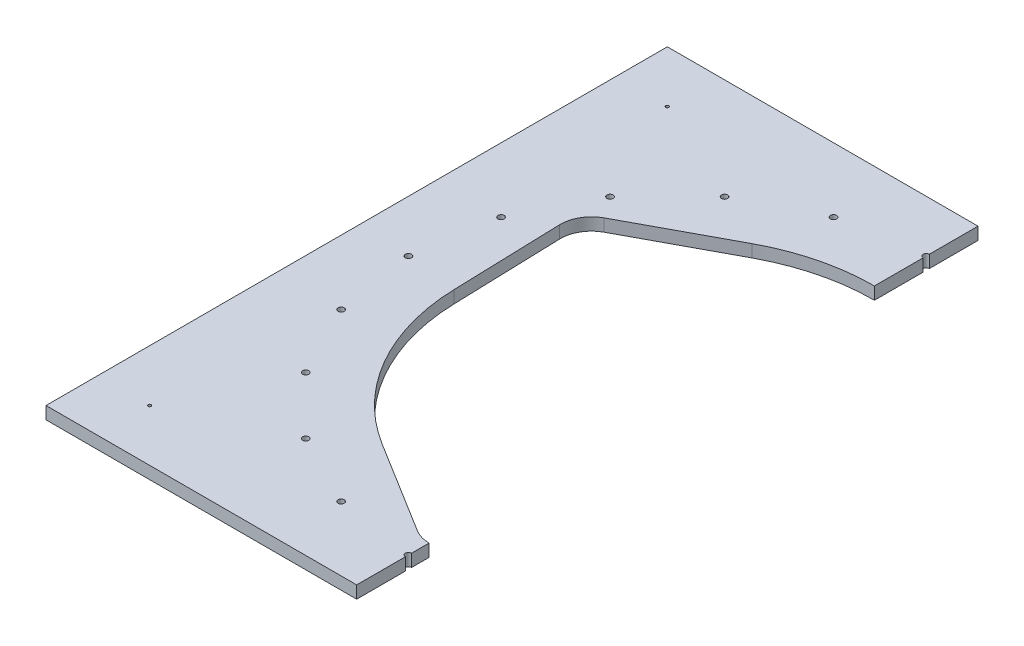
ISO-10303-21;
HEADER;
FILE_DESCRIPTION(('STEP AP214'),'2;1');
FILE_NAME('part.step','',(''),(''),'','','');
FILE_SCHEMA(('AUTOMOTIVE_DESIGN { 1 0 10303 214 1 1 1 1 }'));
ENDSEC;
DATA;
#1=APPLICATION_CONTEXT('core data for automotive mechanical design processes');
#2=APPLICATION_PROTOCOL_DEFINITION('international standard','automotive_design',2000,#1);
#3=PRODUCT_CONTEXT('',#1,'mechanical');
#4=PRODUCT('Part','Part','',(#3));
#5=PRODUCT_RELATED_PRODUCT_CATEGORY('part','',(#4));
#6=PRODUCT_DEFINITION_FORMATION('','',#4);
#7=PRODUCT_DEFINITION_CONTEXT('part definition',#1,'design');
#8=PRODUCT_DEFINITION('design','',#6,#7);
#9=PRODUCT_DEFINITION_SHAPE('','',#8);
#10=(LENGTH_UNIT() NAMED_UNIT(*) SI_UNIT(.MILLI.,.METRE.));
#11=(NAMED_UNIT(*) PLANE_ANGLE_UNIT() SI_UNIT($,.RADIAN.));
#12=(NAMED_UNIT(*) SI_UNIT($,.STERADIAN.) SOLID_ANGLE_UNIT());
#13=UNCERTAINTY_MEASURE_WITH_UNIT(LENGTH_MEASURE(1.E-05),#10,'distance_accuracy_value','');
#14=(GEOMETRIC_REPRESENTATION_CONTEXT(3) GLOBAL_UNCERTAINTY_ASSIGNED_CONTEXT((#13)) GLOBAL_UNIT_ASSIGNED_CONTEXT((#10,
#11,#12)) REPRESENTATION_CONTEXT('',''));
#15=CARTESIAN_POINT('',(0.,0.,0.));
#16=DIRECTION('',(0.,0.,1.));
#17=DIRECTION('',(1.,0.,0.));
#18=AXIS2_PLACEMENT_3D('',#15,#16,#17);
#19=CARTESIAN_POINT('',(2.1374727687235E-11,12.,250.));
#20=DIRECTION('',(0.,-1.,0.));
#21=DIRECTION('',(0.,0.,-1.));
#22=AXIS2_PLACEMENT_3D('',#19,#20,#21);
#23=CYLINDRICAL_SURFACE('',#22,3.);
#24=CARTESIAN_POINT('',(2.1374727687235E-11,0.,250.));
#25=DIRECTION('',(0.,1.,0.));
#26=DIRECTION('',(0.,0.,1.));
#27=AXIS2_PLACEMENT_3D('',#24,#25,#26);
#28=CIRCLE('',#27,3.);
#29=CARTESIAN_POINT('',(1.32749621335318E-12,0.,247.));
#30=VERTEX_POINT('',#29);
#31=CARTESIAN_POINT('',(1.33960480013861E-12,0.,253.));
#32=VERTEX_POINT('',#31);
#33=EDGE_CURVE('E210',#30,#32,#28,.T.);
#34=ORIENTED_EDGE('',*,*,#33,.F.);
#35=DIRECTION('',(0.,-1.,0.));
#36=VECTOR('',#35,1.);
#37=CARTESIAN_POINT('',(1.32749621335318E-12,12.,247.));
#38=LINE('',#37,#36);
#39=CARTESIAN_POINT('',(1.32749621335318E-12,12.,247.));
#40=VERTEX_POINT('',#39);
#41=EDGE_CURVE('E11',#40,#30,#38,.T.);
#42=ORIENTED_EDGE('',*,*,#41,.F.);
#43=CARTESIAN_POINT('',(2.1374727687235E-11,12.,250.));
#44=DIRECTION('',(0.,1.,0.));
#45=DIRECTION('',(0.,0.,1.));
#46=AXIS2_PLACEMENT_3D('',#43,#44,#45);
#47=CIRCLE('',#46,3.);
#48=CARTESIAN_POINT('',(1.33960480013861E-12,12.,253.));
#49=VERTEX_POINT('',#48);
#50=EDGE_CURVE('E287',#40,#49,#47,.T.);
#51=ORIENTED_EDGE('',*,*,#50,.T.);
#52=DIRECTION('',(0.,-1.,0.));
#53=VECTOR('',#52,1.);
#54=CARTESIAN_POINT('',(1.33960480013861E-12,12.,253.));
#55=LINE('',#54,#53);
#56=EDGE_CURVE('E51',#49,#32,#55,.T.);
#57=ORIENTED_EDGE('',*,*,#56,.T.);
#58=EDGE_LOOP('',(#34,#42,#51,#57));
#59=FACE_BOUND('',#58,.T.);
#60=ADVANCED_FACE('F35',(#59),#23,.F.);
#61=CARTESIAN_POINT('',(8.29026057352321E-13,12.,0.));
#62=DIRECTION('',(1.,0.,0.));
#63=DIRECTION('',(0.,0.,-1.));
#64=AXIS2_PLACEMENT_3D('',#61,#62,#63);
#65=PLANE('',#64);
#66=DIRECTION('',(0.,0.,1.));
#67=VECTOR('',#66,1.);
#68=CARTESIAN_POINT('',(8.29026057352321E-13,0.,0.));
#69=LINE('',#68,#67);
#70=CARTESIAN_POINT('',(1.29318855079441E-12,0.,230.));
#71=VERTEX_POINT('',#70);
#72=EDGE_CURVE('E212',#71,#30,#69,.T.);
#73=ORIENTED_EDGE('',*,*,#72,.F.);
#74=DIRECTION('',(0.,-1.,0.));
#75=VECTOR('',#74,1.);
#76=CARTESIAN_POINT('',(1.29318855079441E-12,12.,230.));
#77=LINE('',#76,#75);
#78=CARTESIAN_POINT('',(1.29318855079441E-12,12.,230.));
#79=VERTEX_POINT('',#78);
#80=EDGE_CURVE('E43',#79,#71,#77,.T.);
#81=ORIENTED_EDGE('',*,*,#80,.F.);
#82=DIRECTION('',(0.,0.,1.));
#83=VECTOR('',#82,1.);
#84=CARTESIAN_POINT('',(8.29026057352321E-13,12.,0.));
#85=LINE('',#84,#83);
#86=EDGE_CURVE('E335',#79,#40,#85,.T.);
#87=ORIENTED_EDGE('',*,*,#86,.T.);
#88=ORIENTED_EDGE('',*,*,#41,.T.);
#89=EDGE_LOOP('',(#73,#81,#87,#88));
#90=FACE_BOUND('',#89,.T.);
#91=ADVANCED_FACE('F320',(#90),#65,.T.);
#92=CARTESIAN_POINT('',(0.,12.,200.));
#93=DIRECTION('',(0.,-1.,0.));
#94=DIRECTION('',(0.,0.,-1.));
#95=AXIS2_PLACEMENT_3D('',#92,#93,#94);
#96=CYLINDRICAL_SURFACE('',#95,30.);
#97=CARTESIAN_POINT('',(0.,0.,200.));
#98=DIRECTION('',(0.,1.,0.));
#99=DIRECTION('',(0.,0.,1.));
#100=AXIS2_PLACEMENT_3D('',#97,#98,#99);
#101=CIRCLE('',#100,30.);
#102=CARTESIAN_POINT('',(-15.8034806292791,0.,225.5));
#103=VERTEX_POINT('',#102);
#104=EDGE_CURVE('E215',#103,#71,#101,.T.);
#105=ORIENTED_EDGE('',*,*,#104,.F.);
#106=DIRECTION('',(0.,-1.,0.));
#107=VECTOR('',#106,1.);
#108=CARTESIAN_POINT('',(-15.8034806292791,12.,225.5));
#109=LINE('',#108,#107);
#110=CARTESIAN_POINT('',(-15.8034806292791,12.,225.5));
#111=VERTEX_POINT('',#110);
#112=EDGE_CURVE('E309',#111,#103,#109,.T.);
#113=ORIENTED_EDGE('',*,*,#112,.F.);
#114=CARTESIAN_POINT('',(0.,12.,200.));
#115=DIRECTION('',(0.,1.,0.));
#116=DIRECTION('',(0.,0.,1.));
#117=AXIS2_PLACEMENT_3D('',#114,#115,#116);
#118=CIRCLE('',#117,30.);
#119=EDGE_CURVE('E316',#111,#79,#118,.T.);
#120=ORIENTED_EDGE('',*,*,#119,.T.);
#121=ORIENTED_EDGE('',*,*,#80,.T.);
#122=EDGE_LOOP('',(#105,#113,#120,#121));
#123=FACE_BOUND('',#122,.T.);
#124=ADVANCED_FACE('F314',(#123),#96,.F.);
#125=CARTESIAN_POINT('',(-105.356537528527,12.,170.));
#126=DIRECTION('',(-0.526782687642637,0.,0.85));
#127=DIRECTION('',(0.85,0.,0.526782687642637));
#128=AXIS2_PLACEMENT_3D('',#125,#126,#127);
#129=PLANE('',#128);
#130=DIRECTION('',(-0.85,0.,-0.526782687642637));
#131=VECTOR('',#130,1.);
#132=CARTESIAN_POINT('',(-105.356537528527,0.,170.));
#133=LINE('',#132,#131);
#134=CARTESIAN_POINT('',(-105.356537528527,0.,170.));
#135=VERTEX_POINT('',#134);
#136=EDGE_CURVE('E218',#103,#135,#133,.T.);
#137=ORIENTED_EDGE('',*,*,#136,.T.);
#138=DIRECTION('',(0.,-1.,0.));
#139=VECTOR('',#138,1.);
#140=CARTESIAN_POINT('',(-105.356537528527,12.,170.));
#141=LINE('',#140,#139);
#142=CARTESIAN_POINT('',(-105.356537528527,12.,170.));
#143=VERTEX_POINT('',#142);
#144=EDGE_CURVE('E307',#143,#135,#141,.T.);
#145=ORIENTED_EDGE('',*,*,#144,.F.);
#146=DIRECTION('',(-0.85,0.,-0.526782687642637));
#147=VECTOR('',#146,1.);
#148=CARTESIAN_POINT('',(-105.356537528527,12.,170.));
#149=LINE('',#148,#147);
#150=EDGE_CURVE('E331',#111,#143,#149,.T.);
#151=ORIENTED_EDGE('',*,*,#150,.F.);
#152=ORIENTED_EDGE('',*,*,#112,.T.);
#153=EDGE_LOOP('',(#137,#145,#151,#152));
#154=FACE_BOUND('',#153,.T.);
#155=ADVANCED_FACE('F328',(#154),#129,.F.);
#156=CARTESIAN_POINT('',(0.,12.,0.));
#157=DIRECTION('',(0.,-1.,0.));
#158=DIRECTION('',(0.,0.,-1.));
#159=AXIS2_PLACEMENT_3D('',#156,#157,#158);
#160=CYLINDRICAL_SURFACE('',#159,200.);
#161=CARTESIAN_POINT('',(0.,0.,0.));
#162=DIRECTION('',(0.,1.,0.));
#163=DIRECTION('',(0.,0.,1.));
#164=AXIS2_PLACEMENT_3D('',#161,#162,#163);
#165=CIRCLE('',#164,200.);
#166=CARTESIAN_POINT('',(-199.902587407618,0.,6.24143795447236));
#167=VERTEX_POINT('',#166);
#168=EDGE_CURVE('E221',#167,#135,#165,.T.);
#169=ORIENTED_EDGE('',*,*,#168,.F.);
#170=DIRECTION('',(0.,-1.,0.));
#171=VECTOR('',#170,1.);
#172=CARTESIAN_POINT('',(-199.902587407618,12.,6.24143795447236));
#173=LINE('',#172,#171);
#174=CARTESIAN_POINT('',(-199.902587407618,12.,6.24143795447236));
#175=VERTEX_POINT('',#174);
#176=EDGE_CURVE('E305',#175,#167,#173,.T.);
#177=ORIENTED_EDGE('',*,*,#176,.F.);
#178=CARTESIAN_POINT('',(0.,12.,0.));
#179=DIRECTION('',(0.,1.,0.));
#180=DIRECTION('',(0.,0.,1.));
#181=AXIS2_PLACEMENT_3D('',#178,#179,#180);
#182=CIRCLE('',#181,200.);
#183=EDGE_CURVE('E333',#175,#143,#182,.T.);
#184=ORIENTED_EDGE('',*,*,#183,.T.);
#185=ORIENTED_EDGE('',*,*,#144,.T.);
#186=EDGE_LOOP('',(#169,#177,#184,#185));
#187=FACE_BOUND('',#186,.T.);
#188=ADVANCED_FACE('F390',(#187),#160,.F.);
#189=CARTESIAN_POINT('',(-199.902587407618,12.,6.24143795447234));
#190=DIRECTION('',(0.999512937038091,0.,-0.0312071897723617));
#191=DIRECTION('',(-0.0312071897723617,0.,-0.999512937038092));
#192=AXIS2_PLACEMENT_3D('',#189,#190,#191);
#193=PLANE('',#192);
#194=DIRECTION('',(0.0312071897723617,0.,0.999512937038092));
#195=VECTOR('',#194,1.);
#196=CARTESIAN_POINT('',(-199.902587407618,0.,6.24143795447234));
#197=LINE('',#196,#195);
#198=CARTESIAN_POINT('',(-203.19046886803,0.,-99.06378430683));
#199=VERTEX_POINT('',#198);
#200=EDGE_CURVE('E224',#199,#167,#197,.T.);
#201=ORIENTED_EDGE('',*,*,#200,.F.);
#202=DIRECTION('',(0.,-1.,0.));
#203=VECTOR('',#202,1.);
#204=CARTESIAN_POINT('',(-203.19046886803,12.,-99.06378430683));
#205=LINE('',#204,#203);
#206=CARTESIAN_POINT('',(-203.19046886803,12.,-99.06378430683));
#207=VERTEX_POINT('',#206);
#208=EDGE_CURVE('E303',#207,#199,#205,.T.);
#209=ORIENTED_EDGE('',*,*,#208,.F.);
#210=DIRECTION('',(0.0312071897723617,0.,0.999512937038092));
#211=VECTOR('',#210,1.);
#212=CARTESIAN_POINT('',(-199.902587407618,12.,6.24143795447234));
#213=LINE('',#212,#211);
#214=EDGE_CURVE('E341',#207,#175,#213,.T.);
#215=ORIENTED_EDGE('',*,*,#214,.T.);
#216=ORIENTED_EDGE('',*,*,#176,.T.);
#217=EDGE_LOOP('',(#201,#209,#215,#216));
#218=FACE_BOUND('',#217,.T.);
#219=ADVANCED_FACE('F393',(#218),#193,.T.);
#220=CARTESIAN_POINT('',(-173.205080756887,12.,-100.000000000001));
#221=DIRECTION('',(0.,-1.,0.));
#222=DIRECTION('',(0.,0.,-1.));
#223=AXIS2_PLACEMENT_3D('',#220,#221,#222);
#224=CYLINDRICAL_SURFACE('',#223,30.);
#225=CARTESIAN_POINT('',(-173.205080756887,0.,-100.000000000001));
#226=DIRECTION('',(0.,1.,0.));
#227=DIRECTION('',(0.,0.,1.));
#228=AXIS2_PLACEMENT_3D('',#225,#226,#227);
#229=CIRCLE('',#228,30.);
#230=CARTESIAN_POINT('',(-187.386988238751,0.,-126.436215693172));
#231=VERTEX_POINT('',#230);
#232=EDGE_CURVE('E227',#231,#199,#229,.T.);
#233=ORIENTED_EDGE('',*,*,#232,.F.);
#234=DIRECTION('',(0.,-1.,0.));
#235=VECTOR('',#234,1.);
#236=CARTESIAN_POINT('',(-187.386988238751,12.,-126.436215693172));
#237=LINE('',#236,#235);
#238=CARTESIAN_POINT('',(-187.386988238751,12.,-126.436215693172));
#239=VERTEX_POINT('',#238);
#240=EDGE_CURVE('E301',#239,#231,#237,.T.);
#241=ORIENTED_EDGE('',*,*,#240,.F.);
#242=CARTESIAN_POINT('',(-173.205080756887,12.,-100.000000000001));
#243=DIRECTION('',(0.,1.,0.));
#244=DIRECTION('',(0.,0.,1.));
#245=AXIS2_PLACEMENT_3D('',#242,#243,#244);
#246=CIRCLE('',#245,30.);
#247=EDGE_CURVE('E344',#239,#207,#246,.T.);
#248=ORIENTED_EDGE('',*,*,#247,.T.);
#249=ORIENTED_EDGE('',*,*,#208,.T.);
#250=EDGE_LOOP('',(#233,#241,#248,#249));
#251=FACE_BOUND('',#250,.T.);
#252=ADVANCED_FACE('F397',(#251),#224,.F.);
#253=CARTESIAN_POINT('',(-94.5460498790901,12.,-176.241437954474));
#254=DIRECTION('',(-0.47273024939545,0.,-0.881207189772369));
#255=DIRECTION('',(-0.881207189772369,0.,0.47273024939545));
#256=AXIS2_PLACEMENT_3D('',#253,#254,#255);
#257=PLANE('',#256);
#258=DIRECTION('',(0.881207189772369,0.,-0.47273024939545));
#259=VECTOR('',#258,1.);
#260=CARTESIAN_POINT('',(-94.5460498790901,0.,-176.241437954474));
#261=LINE('',#260,#259);
#262=CARTESIAN_POINT('',(-94.5460498790901,0.,-176.241437954474));
#263=VERTEX_POINT('',#262);
#264=EDGE_CURVE('E230',#231,#263,#261,.T.);
#265=ORIENTED_EDGE('',*,*,#264,.T.);
#266=DIRECTION('',(0.,-1.,0.));
#267=VECTOR('',#266,1.);
#268=CARTESIAN_POINT('',(-94.5460498790901,12.,-176.241437954474));
#269=LINE('',#268,#267);
#270=CARTESIAN_POINT('',(-94.5460498790901,12.,-176.241437954474));
#271=VERTEX_POINT('',#270);
#272=EDGE_CURVE('E299',#271,#263,#269,.T.);
#273=ORIENTED_EDGE('',*,*,#272,.F.);
#274=DIRECTION('',(0.881207189772369,0.,-0.47273024939545));
#275=VECTOR('',#274,1.);
#276=CARTESIAN_POINT('',(-94.5460498790901,12.,-176.241437954474));
#277=LINE('',#276,#275);
#278=EDGE_CURVE('E347',#239,#271,#277,.T.);
#279=ORIENTED_EDGE('',*,*,#278,.F.);
#280=ORIENTED_EDGE('',*,*,#240,.T.);
#281=EDGE_LOOP('',(#265,#273,#279,#280));
#282=FACE_BOUND('',#281,.T.);
#283=ADVANCED_FACE('F401',(#282),#257,.F.);
#284=CARTESIAN_POINT('',(0.,12.,0.));
#285=DIRECTION('',(0.,-1.,0.));
#286=DIRECTION('',(0.,0.,-1.));
#287=AXIS2_PLACEMENT_3D('',#284,#285,#286);
#288=CYLINDRICAL_SURFACE('',#287,200.);
#289=CARTESIAN_POINT('',(0.,0.,0.));
#290=DIRECTION('',(0.,1.,0.));
#291=DIRECTION('',(0.,0.,1.));
#292=AXIS2_PLACEMENT_3D('',#289,#290,#291);
#293=CIRCLE('',#292,200.);
#294=CARTESIAN_POINT('',(4.25406497838065E-13,0.,-200.));
#295=VERTEX_POINT('',#294);
#296=EDGE_CURVE('E233',#295,#263,#293,.T.);
#297=ORIENTED_EDGE('',*,*,#296,.F.);
#298=DIRECTION('',(0.,-1.,0.));
#299=VECTOR('',#298,1.);
#300=CARTESIAN_POINT('',(4.25406497838065E-13,12.,-200.));
#301=LINE('',#300,#299);
#302=CARTESIAN_POINT('',(4.25406497838065E-13,12.,-200.));
#303=VERTEX_POINT('',#302);
#304=EDGE_CURVE('E297',#303,#295,#301,.T.);
#305=ORIENTED_EDGE('',*,*,#304,.F.);
#306=CARTESIAN_POINT('',(0.,12.,0.));
#307=DIRECTION('',(0.,1.,0.));
#308=DIRECTION('',(0.,0.,1.));
#309=AXIS2_PLACEMENT_3D('',#306,#307,#308);
#310=CIRCLE('',#309,200.);
#311=EDGE_CURVE('E349',#303,#271,#310,.T.);
#312=ORIENTED_EDGE('',*,*,#311,.T.);
#313=ORIENTED_EDGE('',*,*,#272,.T.);
#314=EDGE_LOOP('',(#297,#305,#312,#313));
#315=FACE_BOUND('',#314,.T.);
#316=ADVANCED_FACE('F405',(#315),#288,.F.);
#317=CARTESIAN_POINT('',(8.29026057352636E-13,12.,0.));
#318=DIRECTION('',(1.,0.,0.));
#319=DIRECTION('',(0.,0.,-1.));
#320=AXIS2_PLACEMENT_3D('',#317,#318,#319);
#321=PLANE('',#320);
#322=DIRECTION('',(0.,0.,1.));
#323=VECTOR('',#322,1.);
#324=CARTESIAN_POINT('',(8.29026057352636E-13,0.,0.));
#325=LINE('',#324,#323);
#326=CARTESIAN_POINT('',(3.30555901352141E-13,0.,-247.));
#327=VERTEX_POINT('',#326);
#328=EDGE_CURVE('E236',#327,#295,#325,.T.);
#329=ORIENTED_EDGE('',*,*,#328,.F.);
#330=DIRECTION('',(0.,-1.,0.));
#331=VECTOR('',#330,1.);
#332=CARTESIAN_POINT('',(3.30555901352141E-13,12.,-247.));
#333=LINE('',#332,#331);
#334=CARTESIAN_POINT('',(3.30555901352141E-13,12.,-247.));
#335=VERTEX_POINT('',#334);
#336=EDGE_CURVE('E295',#335,#327,#333,.T.);
#337=ORIENTED_EDGE('',*,*,#336,.F.);
#338=DIRECTION('',(0.,0.,1.));
#339=VECTOR('',#338,1.);
#340=CARTESIAN_POINT('',(8.29026057352636E-13,12.,0.));
#341=LINE('',#340,#339);
#342=EDGE_CURVE('E352',#335,#303,#341,.T.);
#343=ORIENTED_EDGE('',*,*,#342,.T.);
#344=ORIENTED_EDGE('',*,*,#304,.T.);
#345=EDGE_LOOP('',(#329,#337,#343,#344));
#346=FACE_BOUND('',#345,.T.);
#347=ADVANCED_FACE('F409',(#346),#321,.T.);
#348=CARTESIAN_POINT('',(-1.6220562773033E-13,12.,-250.));
#349=DIRECTION('',(0.,-1.,0.));
#350=DIRECTION('',(0.,0.,-1.));
#351=AXIS2_PLACEMENT_3D('',#348,#349,#350);
#352=CYLINDRICAL_SURFACE('',#351,3.);
#353=CARTESIAN_POINT('',(-1.6220562773033E-13,0.,-250.));
#354=DIRECTION('',(0.,1.,0.));
#355=DIRECTION('',(0.,0.,1.));
#356=AXIS2_PLACEMENT_3D('',#353,#354,#355);
#357=CIRCLE('',#356,3.);
#358=CARTESIAN_POINT('',(3.18447314566703E-13,0.,-253.));
#359=VERTEX_POINT('',#358);
#360=EDGE_CURVE('E239',#359,#327,#357,.T.);
#361=ORIENTED_EDGE('',*,*,#360,.F.);
#362=DIRECTION('',(0.,-1.,0.));
#363=VECTOR('',#362,1.);
#364=CARTESIAN_POINT('',(3.18447314566703E-13,12.,-253.));
#365=LINE('',#364,#363);
#366=CARTESIAN_POINT('',(3.18447314566703E-13,12.,-253.));
#367=VERTEX_POINT('',#366);
#368=EDGE_CURVE('E293',#367,#359,#365,.T.);
#369=ORIENTED_EDGE('',*,*,#368,.F.);
#370=CARTESIAN_POINT('',(-1.6220562773033E-13,12.,-250.));
#371=DIRECTION('',(0.,1.,0.));
#372=DIRECTION('',(0.,0.,1.));
#373=AXIS2_PLACEMENT_3D('',#370,#371,#372);
#374=CIRCLE('',#373,3.);
#375=EDGE_CURVE('E355',#367,#335,#374,.T.);
#376=ORIENTED_EDGE('',*,*,#375,.T.);
#377=ORIENTED_EDGE('',*,*,#336,.T.);
#378=EDGE_LOOP('',(#361,#369,#376,#377));
#379=FACE_BOUND('',#378,.T.);
#380=ADVANCED_FACE('F413',(#379),#352,.F.);
#381=CARTESIAN_POINT('',(8.33203553399565E-13,12.,0.));
#382=DIRECTION('',(1.,0.,0.));
#383=DIRECTION('',(0.,0.,-1.));
#384=AXIS2_PLACEMENT_3D('',#381,#382,#383);
#385=PLANE('',#384);
#386=DIRECTION('',(0.,0.,1.));
#387=VECTOR('',#386,1.);
#388=CARTESIAN_POINT('',(8.33203553399565E-13,0.,0.));
#389=LINE('',#388,#387);
#390=CARTESIAN_POINT('',(2.22820661502879E-13,0.,-300.000000000006));
#391=VERTEX_POINT('',#390);
#392=EDGE_CURVE('E242',#391,#359,#389,.T.);
#393=ORIENTED_EDGE('',*,*,#392,.F.);
#394=DIRECTION('',(0.,-1.,0.));
#395=VECTOR('',#394,1.);
#396=CARTESIAN_POINT('',(2.22820661502879E-13,12.,-300.000000000006));
#397=LINE('',#396,#395);
#398=CARTESIAN_POINT('',(2.22820661502879E-13,12.,-300.000000000006));
#399=VERTEX_POINT('',#398);
#400=EDGE_CURVE('E291',#399,#391,#397,.T.);
#401=ORIENTED_EDGE('',*,*,#400,.F.);
#402=DIRECTION('',(0.,0.,1.));
#403=VECTOR('',#402,1.);
#404=CARTESIAN_POINT('',(8.33203553399565E-13,12.,0.));
#405=LINE('',#404,#403);
#406=EDGE_CURVE('E358',#399,#367,#405,.T.);
#407=ORIENTED_EDGE('',*,*,#406,.T.);
#408=ORIENTED_EDGE('',*,*,#368,.T.);
#409=EDGE_LOOP('',(#393,#401,#407,#408));
#410=FACE_BOUND('',#409,.T.);
#411=ADVANCED_FACE('F417',(#410),#385,.T.);
#412=CARTESIAN_POINT('',(-5.71764857681966E-12,12.,-300.000000000006));
#413=DIRECTION('',(0.,0.,-1.));
#414=DIRECTION('',(-1.,0.,0.));
#415=AXIS2_PLACEMENT_3D('',#412,#413,#414);
#416=PLANE('',#415);
#417=DIRECTION('',(1.,0.,0.));
#418=VECTOR('',#417,1.);
#419=CARTESIAN_POINT('',(-5.71764857681966E-12,0.,-300.000000000006));
#420=LINE('',#419,#418);
#421=CARTESIAN_POINT('',(-300.,0.,-300.));
#422=VERTEX_POINT('',#421);
#423=EDGE_CURVE('E245',#422,#391,#420,.T.);
#424=ORIENTED_EDGE('',*,*,#423,.F.);
#425=DIRECTION('',(0.,-1.,0.));
#426=VECTOR('',#425,1.);
#427=CARTESIAN_POINT('',(-300.,12.,-300.));
#428=LINE('',#427,#426);
#429=CARTESIAN_POINT('',(-300.,12.,-300.));
#430=VERTEX_POINT('',#429);
#431=EDGE_CURVE('E169',#430,#422,#428,.T.);
#432=ORIENTED_EDGE('',*,*,#431,.F.);
#433=DIRECTION('',(1.,0.,0.));
#434=VECTOR('',#433,1.);
#435=CARTESIAN_POINT('',(-5.71764857681966E-12,12.,-300.000000000006));
#436=LINE('',#435,#434);
#437=EDGE_CURVE('E159',#430,#399,#436,.T.);
#438=ORIENTED_EDGE('',*,*,#437,.T.);
#439=ORIENTED_EDGE('',*,*,#400,.T.);
#440=EDGE_LOOP('',(#424,#432,#438,#439));
#441=FACE_BOUND('',#440,.T.);
#442=ADVANCED_FACE('F362',(#441),#416,.T.);
#443=CARTESIAN_POINT('',(-300.,12.,0.));
#444=DIRECTION('',(1.,0.,0.));
#445=DIRECTION('',(0.,0.,-1.));
#446=AXIS2_PLACEMENT_3D('',#443,#444,#445);
#447=PLANE('',#446);
#448=DIRECTION('',(0.,0.,1.));
#449=VECTOR('',#448,1.);
#450=CARTESIAN_POINT('',(-300.,0.,0.));
#451=LINE('',#450,#449);
#452=CARTESIAN_POINT('',(-300.,0.,300.));
#453=VERTEX_POINT('',#452);
#454=EDGE_CURVE('E166',#422,#453,#451,.T.);
#455=ORIENTED_EDGE('',*,*,#454,.T.);
#456=DIRECTION('',(0.,-1.,0.));
#457=VECTOR('',#456,1.);
#458=CARTESIAN_POINT('',(-300.,12.,300.));
#459=LINE('',#458,#457);
#460=CARTESIAN_POINT('',(-300.,12.,300.));
#461=VERTEX_POINT('',#460);
#462=EDGE_CURVE('E163',#461,#453,#459,.T.);
#463=ORIENTED_EDGE('',*,*,#462,.F.);
#464=DIRECTION('',(0.,0.,1.));
#465=VECTOR('',#464,1.);
#466=CARTESIAN_POINT('',(-300.,12.,0.));
#467=LINE('',#466,#465);
#468=EDGE_CURVE('E150',#430,#461,#467,.T.);
#469=ORIENTED_EDGE('',*,*,#468,.F.);
#470=ORIENTED_EDGE('',*,*,#431,.T.);
#471=EDGE_LOOP('',(#455,#463,#469,#470));
#472=FACE_BOUND('',#471,.T.);
#473=ADVANCED_FACE('F164',(#472),#447,.F.);
#474=CARTESIAN_POINT('',(-5.71764857681964E-12,12.,300.000000000006));
#475=DIRECTION('',(0.,0.,-1.));
#476=DIRECTION('',(-1.,0.,0.));
#477=AXIS2_PLACEMENT_3D('',#474,#475,#476);
#478=PLANE('',#477);
#479=DIRECTION('',(1.,0.,0.));
#480=VECTOR('',#479,1.);
#481=CARTESIAN_POINT('',(-5.71764857681964E-12,0.,300.000000000006));
#482=LINE('',#481,#480);
#483=CARTESIAN_POINT('',(1.43887266431862E-12,0.,300.000000000006));
#484=VERTEX_POINT('',#483);
#485=EDGE_CURVE('E249',#453,#484,#482,.T.);
#486=ORIENTED_EDGE('',*,*,#485,.T.);
#487=DIRECTION('',(0.,-1.,0.));
#488=VECTOR('',#487,1.);
#489=CARTESIAN_POINT('',(1.43887266431862E-12,12.,300.000000000006));
#490=LINE('',#489,#488);
#491=CARTESIAN_POINT('',(1.43887266431862E-12,12.,300.000000000006));
#492=VERTEX_POINT('',#491);
#493=EDGE_CURVE('E101',#492,#484,#490,.T.);
#494=ORIENTED_EDGE('',*,*,#493,.F.);
#495=DIRECTION('',(1.,0.,0.));
#496=VECTOR('',#495,1.);
#497=CARTESIAN_POINT('',(-5.71764857681964E-12,12.,300.000000000006));
#498=LINE('',#497,#496);
#499=EDGE_CURVE('E156',#461,#492,#498,.T.);
#500=ORIENTED_EDGE('',*,*,#499,.F.);
#501=ORIENTED_EDGE('',*,*,#462,.T.);
#502=EDGE_LOOP('',(#486,#494,#500,#501));
#503=FACE_BOUND('',#502,.T.);
#504=ADVANCED_FACE('F171',(#503),#478,.F.);
#505=CARTESIAN_POINT('',(-250.,12.,-250.));
#506=DIRECTION('',(0.,-1.,0.));
#507=DIRECTION('',(0.,0.,-1.));
#508=AXIS2_PLACEMENT_3D('',#505,#506,#507);
#509=CYLINDRICAL_SURFACE('',#508,1.5);
#510=CARTESIAN_POINT('',(-250.,12.,-250.));
#511=DIRECTION('',(0.,1.,0.));
#512=DIRECTION('',(0.,0.,1.));
#513=AXIS2_PLACEMENT_3D('',#510,#511,#512);
#514=CIRCLE('',#513,1.5);
#515=CARTESIAN_POINT('',(-250.,12.,-248.5));
#516=VERTEX_POINT('',#515);
#517=EDGE_CURVE('E204',#516,#516,#514,.T.);
#518=ORIENTED_EDGE('',*,*,#517,.T.);
#519=EDGE_LOOP('',(#518));
#520=FACE_BOUND('',#519,.T.);
#521=CARTESIAN_POINT('',(-250.,0.,-250.));
#522=DIRECTION('',(0.,1.,0.));
#523=DIRECTION('',(0.,0.,1.));
#524=AXIS2_PLACEMENT_3D('',#521,#522,#523);
#525=CIRCLE('',#524,1.5);
#526=CARTESIAN_POINT('',(-250.,0.,-248.5));
#527=VERTEX_POINT('',#526);
#528=EDGE_CURVE('E281',#527,#527,#525,.T.);
#529=ORIENTED_EDGE('',*,*,#528,.F.);
#530=EDGE_LOOP('',(#529));
#531=FACE_BOUND('',#530,.T.);
#532=ADVANCED_FACE('F426',(#520,#531),#509,.F.);
#533=CARTESIAN_POINT('',(-77.2542485937339,12.,-237.764129073789));
#534=DIRECTION('',(0.,-1.,0.));
#535=DIRECTION('',(0.,0.,-1.));
#536=AXIS2_PLACEMENT_3D('',#533,#534,#535);
#537=CYLINDRICAL_SURFACE('',#536,3.00000000000001);
#538=CARTESIAN_POINT('',(-77.2542485937339,12.,-237.764129073789));
#539=DIRECTION('',(0.,1.,0.));
#540=DIRECTION('',(0.,0.,1.));
#541=AXIS2_PLACEMENT_3D('',#538,#539,#540);
#542=CIRCLE('',#541,3.00000000000001);
#543=CARTESIAN_POINT('',(-77.2542485937339,12.,-234.764129073789));
#544=VERTEX_POINT('',#543);
#545=EDGE_CURVE('E201',#544,#544,#542,.T.);
#546=ORIENTED_EDGE('',*,*,#545,.T.);
#547=EDGE_LOOP('',(#546));
#548=FACE_BOUND('',#547,.T.);
#549=CARTESIAN_POINT('',(-77.2542485937339,0.,-237.764129073789));
#550=DIRECTION('',(0.,1.,0.));
#551=DIRECTION('',(0.,0.,1.));
#552=AXIS2_PLACEMENT_3D('',#549,#550,#551);
#553=CIRCLE('',#552,3.00000000000001);
#554=CARTESIAN_POINT('',(-77.2542485937339,0.,-234.764129073789));
#555=VERTEX_POINT('',#554);
#556=EDGE_CURVE('E278',#555,#555,#553,.T.);
#557=ORIENTED_EDGE('',*,*,#556,.F.);
#558=EDGE_LOOP('',(#557));
#559=FACE_BOUND('',#558,.T.);
#560=ADVANCED_FACE('F430',(#548,#559),#537,.F.);
#561=CARTESIAN_POINT('',(-146.946313073116,12.,-202.254248593731));
#562=DIRECTION('',(0.,-1.,0.));
#563=DIRECTION('',(0.,0.,-1.));
#564=AXIS2_PLACEMENT_3D('',#561,#562,#563);
#565=CYLINDRICAL_SURFACE('',#564,2.99999999999999);
#566=CARTESIAN_POINT('',(-146.946313073116,12.,-202.254248593731));
#567=DIRECTION('',(0.,1.,0.));
#568=DIRECTION('',(0.,0.,1.));
#569=AXIS2_PLACEMENT_3D('',#566,#567,#568);
#570=CIRCLE('',#569,2.99999999999999);
#571=CARTESIAN_POINT('',(-146.946313073116,12.,-199.254248593731));
#572=VERTEX_POINT('',#571);
#573=EDGE_CURVE('E198',#572,#572,#570,.T.);
#574=ORIENTED_EDGE('',*,*,#573,.T.);
#575=EDGE_LOOP('',(#574));
#576=FACE_BOUND('',#575,.T.);
#577=CARTESIAN_POINT('',(-146.946313073116,0.,-202.254248593731));
#578=DIRECTION('',(0.,1.,0.));
#579=DIRECTION('',(0.,0.,1.));
#580=AXIS2_PLACEMENT_3D('',#577,#578,#579);
#581=CIRCLE('',#580,2.99999999999999);
#582=CARTESIAN_POINT('',(-146.946313073116,0.,-199.254248593731));
#583=VERTEX_POINT('',#582);
#584=EDGE_CURVE('E275',#583,#583,#581,.T.);
#585=ORIENTED_EDGE('',*,*,#584,.F.);
#586=EDGE_LOOP('',(#585));
#587=FACE_BOUND('',#586,.T.);
#588=ADVANCED_FACE('F436',(#576,#587),#565,.F.);
#589=CARTESIAN_POINT('',(-202.254248593732,12.,-146.94631307311));
#590=DIRECTION('',(0.,-1.,0.));
#591=DIRECTION('',(0.,0.,-1.));
#592=AXIS2_PLACEMENT_3D('',#589,#590,#591);
#593=CYLINDRICAL_SURFACE('',#592,2.99999999999999);
#594=CARTESIAN_POINT('',(-202.254248593732,12.,-146.94631307311));
#595=DIRECTION('',(0.,1.,0.));
#596=DIRECTION('',(0.,0.,1.));
#597=AXIS2_PLACEMENT_3D('',#594,#595,#596);
#598=CIRCLE('',#597,2.99999999999999);
#599=CARTESIAN_POINT('',(-202.254248593732,12.,-143.94631307311));
#600=VERTEX_POINT('',#599);
#601=EDGE_CURVE('E195',#600,#600,#598,.T.);
#602=ORIENTED_EDGE('',*,*,#601,.T.);
#603=EDGE_LOOP('',(#602));
#604=FACE_BOUND('',#603,.T.);
#605=CARTESIAN_POINT('',(-202.254248593732,0.,-146.94631307311));
#606=DIRECTION('',(0.,1.,0.));
#607=DIRECTION('',(0.,0.,1.));
#608=AXIS2_PLACEMENT_3D('',#605,#606,#607);
#609=CIRCLE('',#608,2.99999999999999);
#610=CARTESIAN_POINT('',(-202.254248593732,0.,-143.94631307311));
#611=VERTEX_POINT('',#610);
#612=EDGE_CURVE('E272',#611,#611,#609,.T.);
#613=ORIENTED_EDGE('',*,*,#612,.F.);
#614=EDGE_LOOP('',(#613));
#615=FACE_BOUND('',#614,.T.);
#616=ADVANCED_FACE('F444',(#604,#615),#593,.F.);
#617=CARTESIAN_POINT('',(-237.764129073781,12.,-77.2542485937267));
#618=DIRECTION('',(0.,-1.,0.));
#619=DIRECTION('',(0.,0.,-1.));
#620=AXIS2_PLACEMENT_3D('',#617,#618,#619);
#621=CYLINDRICAL_SURFACE('',#620,2.99999999999999);
#622=CARTESIAN_POINT('',(-237.764129073781,12.,-77.2542485937267));
#623=DIRECTION('',(0.,1.,0.));
#624=DIRECTION('',(0.,0.,1.));
#625=AXIS2_PLACEMENT_3D('',#622,#623,#624);
#626=CIRCLE('',#625,2.99999999999999);
#627=CARTESIAN_POINT('',(-237.764129073781,12.,-74.2542485937267));
#628=VERTEX_POINT('',#627);
#629=EDGE_CURVE('E192',#628,#628,#626,.T.);
#630=ORIENTED_EDGE('',*,*,#629,.T.);
#631=EDGE_LOOP('',(#630));
#632=FACE_BOUND('',#631,.T.);
#633=CARTESIAN_POINT('',(-237.764129073781,0.,-77.2542485937267));
#634=DIRECTION('',(0.,1.,0.));
#635=DIRECTION('',(0.,0.,1.));
#636=AXIS2_PLACEMENT_3D('',#633,#634,#635);
#637=CIRCLE('',#636,2.99999999999999);
#638=CARTESIAN_POINT('',(-237.764129073781,0.,-74.2542485937267));
#639=VERTEX_POINT('',#638);
#640=EDGE_CURVE('E269',#639,#639,#637,.T.);
#641=ORIENTED_EDGE('',*,*,#640,.F.);
#642=EDGE_LOOP('',(#641));
#643=FACE_BOUND('',#642,.T.);
#644=ADVANCED_FACE('F448',(#632,#643),#621,.F.);
#645=CARTESIAN_POINT('',(-249.999999999989,12.,1.07179800135962E-11));
#646=DIRECTION('',(0.,-1.,0.));
#647=DIRECTION('',(0.,0.,-1.));
#648=AXIS2_PLACEMENT_3D('',#645,#646,#647);
#649=CYLINDRICAL_SURFACE('',#648,2.99999999999999);
#650=CARTESIAN_POINT('',(-249.999999999989,12.,1.07179800135962E-11));
#651=DIRECTION('',(0.,1.,0.));
#652=DIRECTION('',(0.,0.,1.));
#653=AXIS2_PLACEMENT_3D('',#650,#651,#652);
#654=CIRCLE('',#653,2.99999999999999);
#655=CARTESIAN_POINT('',(-249.999999999989,12.,3.00000000001071));
#656=VERTEX_POINT('',#655);
#657=EDGE_CURVE('E189',#656,#656,#654,.T.);
#658=ORIENTED_EDGE('',*,*,#657,.T.);
#659=EDGE_LOOP('',(#658));
#660=FACE_BOUND('',#659,.T.);
#661=CARTESIAN_POINT('',(-249.999999999989,0.,1.07179800135962E-11));
#662=DIRECTION('',(0.,1.,0.));
#663=DIRECTION('',(0.,0.,1.));
#664=AXIS2_PLACEMENT_3D('',#661,#662,#663);
#665=CIRCLE('',#664,2.99999999999999);
#666=CARTESIAN_POINT('',(-249.999999999989,0.,3.00000000001071));
#667=VERTEX_POINT('',#666);
#668=EDGE_CURVE('E266',#667,#667,#665,.T.);
#669=ORIENTED_EDGE('',*,*,#668,.F.);
#670=EDGE_LOOP('',(#669));
#671=FACE_BOUND('',#670,.T.);
#672=ADVANCED_FACE('F452',(#660,#671),#649,.F.);
#673=CARTESIAN_POINT('',(-237.764129073774,12.,77.254248593747));
#674=DIRECTION('',(0.,-1.,0.));
#675=DIRECTION('',(0.,0.,-1.));
#676=AXIS2_PLACEMENT_3D('',#673,#674,#675);
#677=CYLINDRICAL_SURFACE('',#676,2.99999999999999);
#678=CARTESIAN_POINT('',(-237.764129073774,12.,77.254248593747));
#679=DIRECTION('',(0.,1.,0.));
#680=DIRECTION('',(0.,0.,1.));
#681=AXIS2_PLACEMENT_3D('',#678,#679,#680);
#682=CIRCLE('',#681,2.99999999999999);
#683=CARTESIAN_POINT('',(-237.764129073774,12.,80.254248593747));
#684=VERTEX_POINT('',#683);
#685=EDGE_CURVE('E186',#684,#684,#682,.T.);
#686=ORIENTED_EDGE('',*,*,#685,.T.);
#687=EDGE_LOOP('',(#686));
#688=FACE_BOUND('',#687,.T.);
#689=CARTESIAN_POINT('',(-237.764129073774,0.,77.254248593747));
#690=DIRECTION('',(0.,1.,0.));
#691=DIRECTION('',(0.,0.,1.));
#692=AXIS2_PLACEMENT_3D('',#689,#690,#691);
#693=CIRCLE('',#692,2.99999999999999);
#694=CARTESIAN_POINT('',(-237.764129073774,0.,80.254248593747));
#695=VERTEX_POINT('',#694);
#696=EDGE_CURVE('E263',#695,#695,#693,.T.);
#697=ORIENTED_EDGE('',*,*,#696,.F.);
#698=EDGE_LOOP('',(#697));
#699=FACE_BOUND('',#698,.T.);
#700=ADVANCED_FACE('F456',(#688,#699),#677,.F.);
#701=CARTESIAN_POINT('',(-202.25424859372,12.,146.946313073127));
#702=DIRECTION('',(0.,-1.,0.));
#703=DIRECTION('',(0.,0.,-1.));
#704=AXIS2_PLACEMENT_3D('',#701,#702,#703);
#705=CYLINDRICAL_SURFACE('',#704,2.99999999999999);
#706=CARTESIAN_POINT('',(-202.25424859372,12.,146.946313073127));
#707=DIRECTION('',(0.,1.,0.));
#708=DIRECTION('',(0.,0.,1.));
#709=AXIS2_PLACEMENT_3D('',#706,#707,#708);
#710=CIRCLE('',#709,2.99999999999999);
#711=CARTESIAN_POINT('',(-202.25424859372,12.,149.946313073127));
#712=VERTEX_POINT('',#711);
#713=EDGE_CURVE('E183',#712,#712,#710,.T.);
#714=ORIENTED_EDGE('',*,*,#713,.T.);
#715=EDGE_LOOP('',(#714));
#716=FACE_BOUND('',#715,.T.);
#717=CARTESIAN_POINT('',(-202.25424859372,0.,146.946313073127));
#718=DIRECTION('',(0.,1.,0.));
#719=DIRECTION('',(0.,0.,1.));
#720=AXIS2_PLACEMENT_3D('',#717,#718,#719);
#721=CIRCLE('',#720,2.99999999999999);
#722=CARTESIAN_POINT('',(-202.25424859372,0.,149.946313073127));
#723=VERTEX_POINT('',#722);
#724=EDGE_CURVE('E260',#723,#723,#721,.T.);
#725=ORIENTED_EDGE('',*,*,#724,.F.);
#726=EDGE_LOOP('',(#725));
#727=FACE_BOUND('',#726,.T.);
#728=ADVANCED_FACE('F460',(#716,#727),#705,.F.);
#729=CARTESIAN_POINT('',(-146.946313073099,12.,202.254248593743));
#730=DIRECTION('',(0.,-1.,0.));
#731=DIRECTION('',(0.,0.,-1.));
#732=AXIS2_PLACEMENT_3D('',#729,#730,#731);
#733=CYLINDRICAL_SURFACE('',#732,2.99999999999999);
#734=CARTESIAN_POINT('',(-146.946313073099,12.,202.254248593743));
#735=DIRECTION('',(0.,1.,0.));
#736=DIRECTION('',(0.,0.,1.));
#737=AXIS2_PLACEMENT_3D('',#734,#735,#736);
#738=CIRCLE('',#737,2.99999999999999);
#739=CARTESIAN_POINT('',(-146.946313073099,12.,205.254248593743));
#740=VERTEX_POINT('',#739);
#741=EDGE_CURVE('E180',#740,#740,#738,.T.);
#742=ORIENTED_EDGE('',*,*,#741,.T.);
#743=EDGE_LOOP('',(#742));
#744=FACE_BOUND('',#743,.T.);
#745=CARTESIAN_POINT('',(-146.946313073099,0.,202.254248593743));
#746=DIRECTION('',(0.,1.,0.));
#747=DIRECTION('',(0.,0.,1.));
#748=AXIS2_PLACEMENT_3D('',#745,#746,#747);
#749=CIRCLE('',#748,2.99999999999999);
#750=CARTESIAN_POINT('',(-146.946313073099,0.,205.254248593743));
#751=VERTEX_POINT('',#750);
#752=EDGE_CURVE('E257',#751,#751,#749,.T.);
#753=ORIENTED_EDGE('',*,*,#752,.F.);
#754=EDGE_LOOP('',(#753));
#755=FACE_BOUND('',#754,.T.);
#756=ADVANCED_FACE('F375',(#744,#755),#733,.F.);
#757=CARTESIAN_POINT('',(-77.254248593716,12.,237.764129073792));
#758=DIRECTION('',(0.,-1.,0.));
#759=DIRECTION('',(0.,0.,-1.));
#760=AXIS2_PLACEMENT_3D('',#757,#758,#759);
#761=CYLINDRICAL_SURFACE('',#760,3.00000000000001);
#762=CARTESIAN_POINT('',(-77.254248593716,12.,237.764129073792));
#763=DIRECTION('',(0.,1.,0.));
#764=DIRECTION('',(0.,0.,1.));
#765=AXIS2_PLACEMENT_3D('',#762,#763,#764);
#766=CIRCLE('',#765,3.00000000000001);
#767=CARTESIAN_POINT('',(-77.254248593716,12.,240.764129073792));
#768=VERTEX_POINT('',#767);
#769=EDGE_CURVE('E174',#768,#768,#766,.T.);
#770=ORIENTED_EDGE('',*,*,#769,.T.);
#771=EDGE_LOOP('',(#770));
#772=FACE_BOUND('',#771,.T.);
#773=CARTESIAN_POINT('',(-77.254248593716,0.,237.764129073792));
#774=DIRECTION('',(0.,1.,0.));
#775=DIRECTION('',(0.,0.,1.));
#776=AXIS2_PLACEMENT_3D('',#773,#774,#775);
#777=CIRCLE('',#776,3.00000000000001);
#778=CARTESIAN_POINT('',(-77.254248593716,0.,240.764129073792));
#779=VERTEX_POINT('',#778);
#780=EDGE_CURVE('E254',#779,#779,#777,.T.);
#781=ORIENTED_EDGE('',*,*,#780,.F.);
#782=EDGE_LOOP('',(#781));
#783=FACE_BOUND('',#782,.T.);
#784=ADVANCED_FACE('F367',(#772,#783),#761,.F.);
#785=CARTESIAN_POINT('',(8.05247999339925E-13,12.,0.));
#786=DIRECTION('',(1.,0.,0.));
#787=DIRECTION('',(0.,0.,-1.));
#788=AXIS2_PLACEMENT_3D('',#785,#786,#787);
#789=PLANE('',#788);
#790=DIRECTION('',(0.,0.,1.));
#791=VECTOR('',#790,1.);
#792=CARTESIAN_POINT('',(8.05247999339925E-13,0.,0.));
#793=LINE('',#792,#791);
#794=EDGE_CURVE('E251',#32,#484,#793,.T.);
#795=ORIENTED_EDGE('',*,*,#794,.F.);
#796=ORIENTED_EDGE('',*,*,#56,.F.);
#797=DIRECTION('',(0.,0.,1.));
#798=VECTOR('',#797,1.);
#799=CARTESIAN_POINT('',(8.05247999339925E-13,12.,0.));
#800=LINE('',#799,#798);
#801=EDGE_CURVE('E172',#49,#492,#800,.T.);
#802=ORIENTED_EDGE('',*,*,#801,.T.);
#803=ORIENTED_EDGE('',*,*,#493,.T.);
#804=EDGE_LOOP('',(#795,#796,#802,#803));
#805=FACE_BOUND('',#804,.T.);
#806=ADVANCED_FACE('F364',(#805),#789,.T.);
#807=CARTESIAN_POINT('',(-250.,12.,250.));
#808=DIRECTION('',(0.,-1.,0.));
#809=DIRECTION('',(0.,0.,-1.));
#810=AXIS2_PLACEMENT_3D('',#807,#808,#809);
#811=CYLINDRICAL_SURFACE('',#810,1.5);
#812=CARTESIAN_POINT('',(-250.,12.,250.));
#813=DIRECTION('',(0.,1.,0.));
#814=DIRECTION('',(0.,0.,1.));
#815=AXIS2_PLACEMENT_3D('',#812,#813,#814);
#816=CIRCLE('',#815,1.5);
#817=CARTESIAN_POINT('',(-250.,12.,251.5));
#818=VERTEX_POINT('',#817);
#819=EDGE_CURVE('E207',#818,#818,#816,.F.);
#820=ORIENTED_EDGE('',*,*,#819,.F.);
#821=EDGE_LOOP('',(#820));
#822=FACE_BOUND('',#821,.T.);
#823=CARTESIAN_POINT('',(-250.,0.,250.));
#824=DIRECTION('',(0.,1.,0.));
#825=DIRECTION('',(0.,0.,1.));
#826=AXIS2_PLACEMENT_3D('',#823,#824,#825);
#827=CIRCLE('',#826,1.5);
#828=CARTESIAN_POINT('',(-250.,0.,251.5));
#829=VERTEX_POINT('',#828);
#830=EDGE_CURVE('E284',#829,#829,#827,.F.);
#831=ORIENTED_EDGE('',*,*,#830,.T.);
#832=EDGE_LOOP('',(#831));
#833=FACE_BOUND('',#832,.T.);
#834=ADVANCED_FACE('F366',(#822,#833),#811,.F.);
#835=CARTESIAN_POINT('',(0.,12.,0.));
#836=DIRECTION('',(0.,1.,0.));
#837=DIRECTION('',(0.,0.,1.));
#838=AXIS2_PLACEMENT_3D('',#835,#836,#837);
#839=PLANE('',#838);
#840=ORIENTED_EDGE('',*,*,#50,.F.);
#841=ORIENTED_EDGE('',*,*,#86,.F.);
#842=ORIENTED_EDGE('',*,*,#119,.F.);
#843=ORIENTED_EDGE('',*,*,#150,.T.);
#844=ORIENTED_EDGE('',*,*,#183,.F.);
#845=ORIENTED_EDGE('',*,*,#214,.F.);
#846=ORIENTED_EDGE('',*,*,#247,.F.);
#847=ORIENTED_EDGE('',*,*,#278,.T.);
#848=ORIENTED_EDGE('',*,*,#311,.F.);
#849=ORIENTED_EDGE('',*,*,#342,.F.);
#850=ORIENTED_EDGE('',*,*,#375,.F.);
#851=ORIENTED_EDGE('',*,*,#406,.F.);
#852=ORIENTED_EDGE('',*,*,#437,.F.);
#853=ORIENTED_EDGE('',*,*,#468,.T.);
#854=ORIENTED_EDGE('',*,*,#499,.T.);
#855=ORIENTED_EDGE('',*,*,#801,.F.);
#856=EDGE_LOOP('',(#840,#841,#842,#843,#844,#845,#846,#847,#848,#849,#850,#851,#852,#853,#854,#855));
#857=FACE_BOUND('',#856,.T.);
#858=ORIENTED_EDGE('',*,*,#769,.F.);
#859=EDGE_LOOP('',(#858));
#860=FACE_BOUND('',#859,.T.);
#861=ORIENTED_EDGE('',*,*,#741,.F.);
#862=EDGE_LOOP('',(#861));
#863=FACE_BOUND('',#862,.T.);
#864=ORIENTED_EDGE('',*,*,#713,.F.);
#865=EDGE_LOOP('',(#864));
#866=FACE_BOUND('',#865,.T.);
#867=ORIENTED_EDGE('',*,*,#685,.F.);
#868=EDGE_LOOP('',(#867));
#869=FACE_BOUND('',#868,.T.);
#870=ORIENTED_EDGE('',*,*,#657,.F.);
#871=EDGE_LOOP('',(#870));
#872=FACE_BOUND('',#871,.T.);
#873=ORIENTED_EDGE('',*,*,#629,.F.);
#874=EDGE_LOOP('',(#873));
#875=FACE_BOUND('',#874,.T.);
#876=ORIENTED_EDGE('',*,*,#601,.F.);
#877=EDGE_LOOP('',(#876));
#878=FACE_BOUND('',#877,.T.);
#879=ORIENTED_EDGE('',*,*,#573,.F.);
#880=EDGE_LOOP('',(#879));
#881=FACE_BOUND('',#880,.T.);
#882=ORIENTED_EDGE('',*,*,#545,.F.);
#883=EDGE_LOOP('',(#882));
#884=FACE_BOUND('',#883,.T.);
#885=ORIENTED_EDGE('',*,*,#517,.F.);
#886=EDGE_LOOP('',(#885));
#887=FACE_BOUND('',#886,.T.);
#888=ORIENTED_EDGE('',*,*,#819,.T.);
#889=EDGE_LOOP('',(#888));
#890=FACE_BOUND('',#889,.T.);
#891=ADVANCED_FACE('F152',(#857,#860,#863,#866,#869,#872,#875,#878,#881,#884,#887,#890),#839,.T.);
#892=CARTESIAN_POINT('',(0.,0.,0.));
#893=DIRECTION('',(0.,1.,0.));
#894=DIRECTION('',(0.,0.,1.));
#895=AXIS2_PLACEMENT_3D('',#892,#893,#894);
#896=PLANE('',#895);
#897=ORIENTED_EDGE('',*,*,#33,.T.);
#898=ORIENTED_EDGE('',*,*,#794,.T.);
#899=ORIENTED_EDGE('',*,*,#485,.F.);
#900=ORIENTED_EDGE('',*,*,#454,.F.);
#901=ORIENTED_EDGE('',*,*,#423,.T.);
#902=ORIENTED_EDGE('',*,*,#392,.T.);
#903=ORIENTED_EDGE('',*,*,#360,.T.);
#904=ORIENTED_EDGE('',*,*,#328,.T.);
#905=ORIENTED_EDGE('',*,*,#296,.T.);
#906=ORIENTED_EDGE('',*,*,#264,.F.);
#907=ORIENTED_EDGE('',*,*,#232,.T.);
#908=ORIENTED_EDGE('',*,*,#200,.T.);
#909=ORIENTED_EDGE('',*,*,#168,.T.);
#910=ORIENTED_EDGE('',*,*,#136,.F.);
#911=ORIENTED_EDGE('',*,*,#104,.T.);
#912=ORIENTED_EDGE('',*,*,#72,.T.);
#913=EDGE_LOOP('',(#897,#898,#899,#900,#901,#902,#903,#904,#905,#906,#907,#908,#909,#910,#911,#912));
#914=FACE_BOUND('',#913,.T.);
#915=ORIENTED_EDGE('',*,*,#780,.T.);
#916=EDGE_LOOP('',(#915));
#917=FACE_BOUND('',#916,.T.);
#918=ORIENTED_EDGE('',*,*,#752,.T.);
#919=EDGE_LOOP('',(#918));
#920=FACE_BOUND('',#919,.T.);
#921=ORIENTED_EDGE('',*,*,#724,.T.);
#922=EDGE_LOOP('',(#921));
#923=FACE_BOUND('',#922,.T.);
#924=ORIENTED_EDGE('',*,*,#696,.T.);
#925=EDGE_LOOP('',(#924));
#926=FACE_BOUND('',#925,.T.);
#927=ORIENTED_EDGE('',*,*,#668,.T.);
#928=EDGE_LOOP('',(#927));
#929=FACE_BOUND('',#928,.T.);
#930=ORIENTED_EDGE('',*,*,#640,.T.);
#931=EDGE_LOOP('',(#930));
#932=FACE_BOUND('',#931,.T.);
#933=ORIENTED_EDGE('',*,*,#612,.T.);
#934=EDGE_LOOP('',(#933));
#935=FACE_BOUND('',#934,.T.);
#936=ORIENTED_EDGE('',*,*,#584,.T.);
#937=EDGE_LOOP('',(#936));
#938=FACE_BOUND('',#937,.T.);
#939=ORIENTED_EDGE('',*,*,#556,.T.);
#940=EDGE_LOOP('',(#939));
#941=FACE_BOUND('',#940,.T.);
#942=ORIENTED_EDGE('',*,*,#528,.T.);
#943=EDGE_LOOP('',(#942));
#944=FACE_BOUND('',#943,.T.);
#945=ORIENTED_EDGE('',*,*,#830,.F.);
#946=EDGE_LOOP('',(#945));
#947=FACE_BOUND('',#946,.T.);
#948=ADVANCED_FACE('F323',(#914,#917,#920,#923,#926,#929,#932,#935,#938,#941,#944,#947),#896,.F.);
#949=CLOSED_SHELL('',(#60,#91,#124,#155,#188,#219,#252,#283,#316,#347,#380,#411,#442,#473,#504,
#532,#560,#588,#616,#644,#672,#700,#728,#756,#784,#806,#834,#891,#948));
#950=MANIFOLD_SOLID_BREP('B2',#949);
#951=ADVANCED_BREP_SHAPE_REPRESENTATION('',(#18,#950),#14);
#952=SHAPE_DEFINITION_REPRESENTATION(#9,#951);
ENDSEC;
END-ISO-10303-21;
